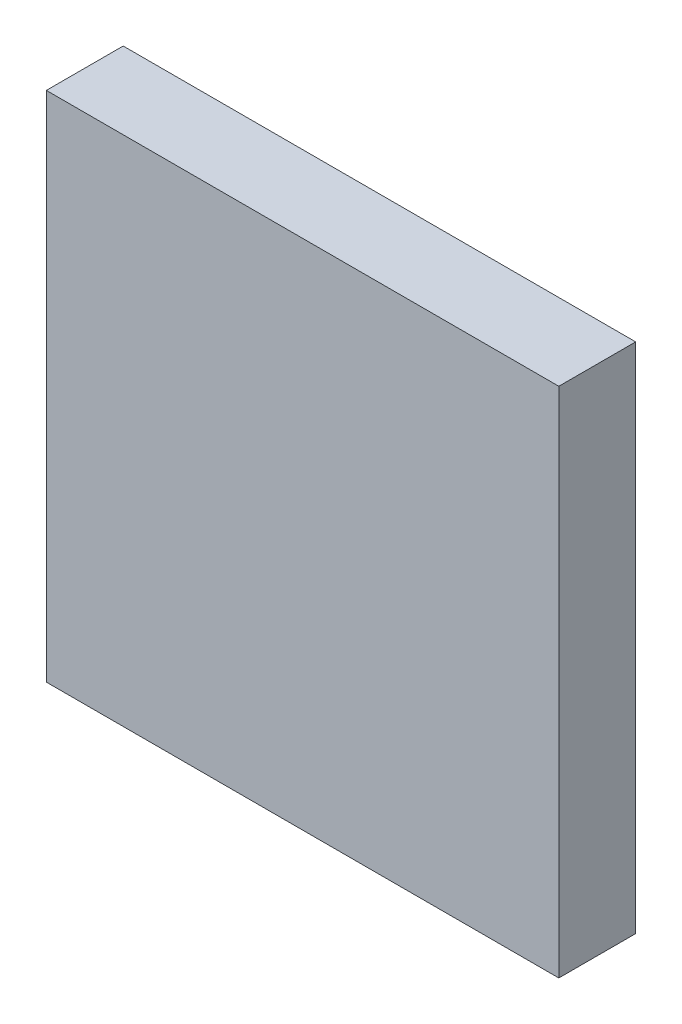
ISO-10303-21;
HEADER;
FILE_DESCRIPTION(('STEP AP214'),'2;1');
FILE_NAME('part.step','',(''),(''),'','','');
FILE_SCHEMA(('AUTOMOTIVE_DESIGN { 1 0 10303 214 1 1 1 1 }'));
ENDSEC;
DATA;
#1=APPLICATION_CONTEXT('core data for automotive mechanical design processes');
#2=APPLICATION_PROTOCOL_DEFINITION('international standard','automotive_design',2000,#1);
#3=PRODUCT_CONTEXT('',#1,'mechanical');
#4=PRODUCT('Part','Part','',(#3));
#5=PRODUCT_RELATED_PRODUCT_CATEGORY('part','',(#4));
#6=PRODUCT_DEFINITION_FORMATION('','',#4);
#7=PRODUCT_DEFINITION_CONTEXT('part definition',#1,'design');
#8=PRODUCT_DEFINITION('design','',#6,#7);
#9=PRODUCT_DEFINITION_SHAPE('','',#8);
#10=(LENGTH_UNIT() NAMED_UNIT(*) SI_UNIT(.MILLI.,.METRE.));
#11=(NAMED_UNIT(*) PLANE_ANGLE_UNIT() SI_UNIT($,.RADIAN.));
#12=(NAMED_UNIT(*) SI_UNIT($,.STERADIAN.) SOLID_ANGLE_UNIT());
#13=UNCERTAINTY_MEASURE_WITH_UNIT(LENGTH_MEASURE(1.E-05),#10,'distance_accuracy_value','');
#14=(GEOMETRIC_REPRESENTATION_CONTEXT(3) GLOBAL_UNCERTAINTY_ASSIGNED_CONTEXT((#13)) GLOBAL_UNIT_ASSIGNED_CONTEXT((#10,
#11,#12)) REPRESENTATION_CONTEXT('',''));
#15=CARTESIAN_POINT('',(0.,0.,0.));
#16=DIRECTION('',(0.,0.,1.));
#17=DIRECTION('',(1.,0.,0.));
#18=AXIS2_PLACEMENT_3D('',#15,#16,#17);
#19=CARTESIAN_POINT('',(500.,-125.,150.));
#20=DIRECTION('',(-1.,0.,0.));
#21=DIRECTION('',(0.,0.,1.));
#22=AXIS2_PLACEMENT_3D('',#19,#20,#21);
#23=PLANE('',#22);
#24=DIRECTION('',(0.,1.,0.));
#25=VECTOR('',#24,1.);
#26=CARTESIAN_POINT('',(500.,-125.,0.));
#27=LINE('',#26,#25);
#28=CARTESIAN_POINT('',(500.,-125.,0.));
#29=VERTEX_POINT('',#28);
#30=CARTESIAN_POINT('',(500.,875.,0.));
#31=VERTEX_POINT('',#30);
#32=EDGE_CURVE('E89',#29,#31,#27,.T.);
#33=ORIENTED_EDGE('',*,*,#32,.T.);
#34=DIRECTION('',(0.,0.,-1.));
#35=VECTOR('',#34,1.);
#36=CARTESIAN_POINT('',(500.,875.,150.));
#37=LINE('',#36,#35);
#38=CARTESIAN_POINT('',(500.,875.,150.));
#39=VERTEX_POINT('',#38);
#40=EDGE_CURVE('E97',#39,#31,#37,.T.);
#41=ORIENTED_EDGE('',*,*,#40,.F.);
#42=DIRECTION('',(0.,1.,0.));
#43=VECTOR('',#42,1.);
#44=CARTESIAN_POINT('',(500.,-125.,150.));
#45=LINE('',#44,#43);
#46=CARTESIAN_POINT('',(500.,-125.,150.));
#47=VERTEX_POINT('',#46);
#48=EDGE_CURVE('E105',#47,#39,#45,.T.);
#49=ORIENTED_EDGE('',*,*,#48,.F.);
#50=DIRECTION('',(0.,0.,-1.));
#51=VECTOR('',#50,1.);
#52=CARTESIAN_POINT('',(500.,-125.,150.));
#53=LINE('',#52,#51);
#54=EDGE_CURVE('E49',#47,#29,#53,.T.);
#55=ORIENTED_EDGE('',*,*,#54,.T.);
#56=EDGE_LOOP('',(#33,#41,#49,#55));
#57=FACE_BOUND('',#56,.T.);
#58=ADVANCED_FACE('F41',(#57),#23,.F.);
#59=CARTESIAN_POINT('',(-500.,-125.,150.));
#60=DIRECTION('',(1.,0.,0.));
#61=DIRECTION('',(0.,0.,-1.));
#62=AXIS2_PLACEMENT_3D('',#59,#60,#61);
#63=PLANE('',#62);
#64=DIRECTION('',(0.,-1.,0.));
#65=VECTOR('',#64,1.);
#66=CARTESIAN_POINT('',(-500.,-125.,0.));
#67=LINE('',#66,#65);
#68=CARTESIAN_POINT('',(-500.,875.,0.));
#69=VERTEX_POINT('',#68);
#70=CARTESIAN_POINT('',(-500.,-125.,0.));
#71=VERTEX_POINT('',#70);
#72=EDGE_CURVE('E68',#69,#71,#67,.T.);
#73=ORIENTED_EDGE('',*,*,#72,.T.);
#74=DIRECTION('',(0.,0.,-1.));
#75=VECTOR('',#74,1.);
#76=CARTESIAN_POINT('',(-500.,-125.,150.));
#77=LINE('',#76,#75);
#78=CARTESIAN_POINT('',(-500.,-125.,150.));
#79=VERTEX_POINT('',#78);
#80=EDGE_CURVE('E11',#79,#71,#77,.T.);
#81=ORIENTED_EDGE('',*,*,#80,.F.);
#82=DIRECTION('',(0.,-1.,0.));
#83=VECTOR('',#82,1.);
#84=CARTESIAN_POINT('',(-500.,-125.,150.));
#85=LINE('',#84,#83);
#86=CARTESIAN_POINT('',(-500.,875.,150.));
#87=VERTEX_POINT('',#86);
#88=EDGE_CURVE('E73',#87,#79,#85,.T.);
#89=ORIENTED_EDGE('',*,*,#88,.F.);
#90=DIRECTION('',(0.,0.,-1.));
#91=VECTOR('',#90,1.);
#92=CARTESIAN_POINT('',(-500.,875.,150.));
#93=LINE('',#92,#91);
#94=EDGE_CURVE('E95',#87,#69,#93,.T.);
#95=ORIENTED_EDGE('',*,*,#94,.T.);
#96=EDGE_LOOP('',(#73,#81,#89,#95));
#97=FACE_BOUND('',#96,.T.);
#98=ADVANCED_FACE('F100',(#97),#63,.F.);
#99=CARTESIAN_POINT('',(-500.,-125.,150.));
#100=DIRECTION('',(0.,1.,0.));
#101=DIRECTION('',(0.,0.,1.));
#102=AXIS2_PLACEMENT_3D('',#99,#100,#101);
#103=PLANE('',#102);
#104=DIRECTION('',(1.,0.,0.));
#105=VECTOR('',#104,1.);
#106=CARTESIAN_POINT('',(-500.,-125.,0.));
#107=LINE('',#106,#105);
#108=EDGE_CURVE('E88',#71,#29,#107,.T.);
#109=ORIENTED_EDGE('',*,*,#108,.T.);
#110=ORIENTED_EDGE('',*,*,#54,.F.);
#111=DIRECTION('',(1.,0.,0.));
#112=VECTOR('',#111,1.);
#113=CARTESIAN_POINT('',(-500.,-125.,150.));
#114=LINE('',#113,#112);
#115=EDGE_CURVE('E57',#79,#47,#114,.T.);
#116=ORIENTED_EDGE('',*,*,#115,.F.);
#117=ORIENTED_EDGE('',*,*,#80,.T.);
#118=EDGE_LOOP('',(#109,#110,#116,#117));
#119=FACE_BOUND('',#118,.T.);
#120=ADVANCED_FACE('F114',(#119),#103,.F.);
#121=CARTESIAN_POINT('',(0.,0.,150.));
#122=DIRECTION('',(0.,0.,-1.));
#123=DIRECTION('',(-1.,0.,0.));
#124=AXIS2_PLACEMENT_3D('',#121,#122,#123);
#125=PLANE('',#124);
#126=ORIENTED_EDGE('',*,*,#48,.T.);
#127=DIRECTION('',(-1.,0.,0.));
#128=VECTOR('',#127,1.);
#129=CARTESIAN_POINT('',(-500.,875.,150.));
#130=LINE('',#129,#128);
#131=EDGE_CURVE('E98',#39,#87,#130,.T.);
#132=ORIENTED_EDGE('',*,*,#131,.T.);
#133=ORIENTED_EDGE('',*,*,#88,.T.);
#134=ORIENTED_EDGE('',*,*,#115,.T.);
#135=EDGE_LOOP('',(#126,#132,#133,#134));
#136=FACE_BOUND('',#135,.T.);
#137=ADVANCED_FACE('F116',(#136),#125,.F.);
#138=CARTESIAN_POINT('',(0.,0.,0.));
#139=DIRECTION('',(0.,0.,-1.));
#140=DIRECTION('',(-1.,0.,0.));
#141=AXIS2_PLACEMENT_3D('',#138,#139,#140);
#142=PLANE('',#141);
#143=ORIENTED_EDGE('',*,*,#32,.F.);
#144=ORIENTED_EDGE('',*,*,#108,.F.);
#145=ORIENTED_EDGE('',*,*,#72,.F.);
#146=DIRECTION('',(-1.,0.,0.));
#147=VECTOR('',#146,1.);
#148=CARTESIAN_POINT('',(-500.,875.,0.));
#149=LINE('',#148,#147);
#150=EDGE_CURVE('E86',#31,#69,#149,.T.);
#151=ORIENTED_EDGE('',*,*,#150,.F.);
#152=EDGE_LOOP('',(#143,#144,#145,#151));
#153=FACE_BOUND('',#152,.T.);
#154=ADVANCED_FACE('F85',(#153),#142,.T.);
#155=CARTESIAN_POINT('',(-500.,875.,150.));
#156=DIRECTION('',(0.,-1.,0.));
#157=DIRECTION('',(0.,0.,-1.));
#158=AXIS2_PLACEMENT_3D('',#155,#156,#157);
#159=PLANE('',#158);
#160=ORIENTED_EDGE('',*,*,#150,.T.);
#161=ORIENTED_EDGE('',*,*,#94,.F.);
#162=ORIENTED_EDGE('',*,*,#131,.F.);
#163=ORIENTED_EDGE('',*,*,#40,.T.);
#164=EDGE_LOOP('',(#160,#161,#162,#163));
#165=FACE_BOUND('',#164,.T.);
#166=ADVANCED_FACE('F93',(#165),#159,.F.);
#167=CLOSED_SHELL('',(#58,#98,#120,#137,#154,#166));
#168=MANIFOLD_SOLID_BREP('B2',#167);
#169=ADVANCED_BREP_SHAPE_REPRESENTATION('',(#18,#168),#14);
#170=SHAPE_DEFINITION_REPRESENTATION(#9,#169);
ENDSEC;
END-ISO-10303-21;
